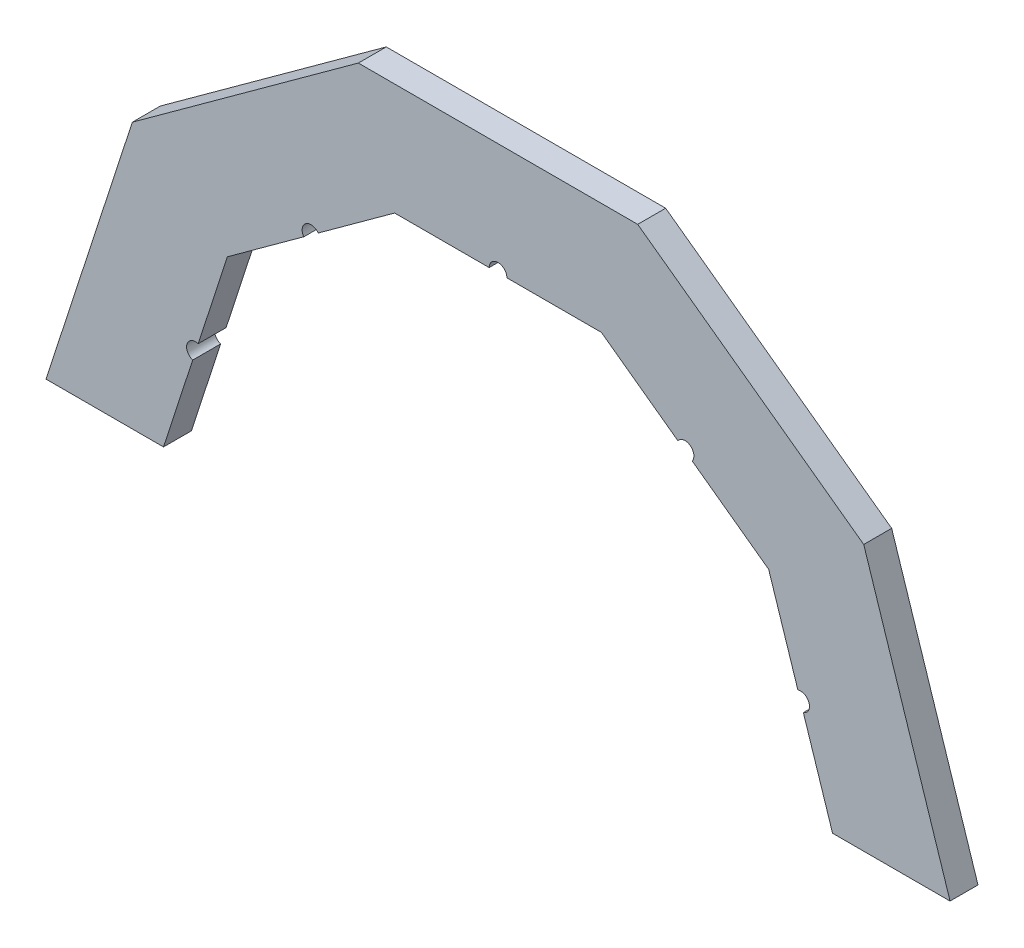
ISO-10303-21;
HEADER;
FILE_DESCRIPTION(('STEP AP214'),'2;1');
FILE_NAME('part.step','',(''),(''),'','','');
FILE_SCHEMA(('AUTOMOTIVE_DESIGN { 1 0 10303 214 1 1 1 1 }'));
ENDSEC;
DATA;
#1=APPLICATION_CONTEXT('core data for automotive mechanical design processes');
#2=APPLICATION_PROTOCOL_DEFINITION('international standard','automotive_design',2000,#1);
#3=PRODUCT_CONTEXT('',#1,'mechanical');
#4=PRODUCT('Part','Part','',(#3));
#5=PRODUCT_RELATED_PRODUCT_CATEGORY('part','',(#4));
#6=PRODUCT_DEFINITION_FORMATION('','',#4);
#7=PRODUCT_DEFINITION_CONTEXT('part definition',#1,'design');
#8=PRODUCT_DEFINITION('design','',#6,#7);
#9=PRODUCT_DEFINITION_SHAPE('','',#8);
#10=(LENGTH_UNIT() NAMED_UNIT(*) SI_UNIT(.MILLI.,.METRE.));
#11=(NAMED_UNIT(*) PLANE_ANGLE_UNIT() SI_UNIT($,.RADIAN.));
#12=(NAMED_UNIT(*) SI_UNIT($,.STERADIAN.) SOLID_ANGLE_UNIT());
#13=UNCERTAINTY_MEASURE_WITH_UNIT(LENGTH_MEASURE(1.E-05),#10,'distance_accuracy_value','');
#14=(GEOMETRIC_REPRESENTATION_CONTEXT(3) GLOBAL_UNCERTAINTY_ASSIGNED_CONTEXT((#13)) GLOBAL_UNIT_ASSIGNED_CONTEXT((#10,
#11,#12)) REPRESENTATION_CONTEXT('',''));
#15=CARTESIAN_POINT('',(0.,0.,0.));
#16=DIRECTION('',(0.,0.,1.));
#17=DIRECTION('',(1.,0.,0.));
#18=AXIS2_PLACEMENT_3D('',#15,#16,#17);
#19=CARTESIAN_POINT('',(119.744909905459,0.,10.));
#20=DIRECTION('',(0.,1.,0.));
#21=DIRECTION('',(-1.,0.,0.));
#22=AXIS2_PLACEMENT_3D('',#19,#20,#21);
#23=PLANE('',#22);
#24=DIRECTION('',(1.,0.,0.));
#25=VECTOR('',#24,1.);
#26=CARTESIAN_POINT('',(119.744909905459,0.,0.));
#27=LINE('',#26,#25);
#28=CARTESIAN_POINT('',(119.744909905459,0.,0.));
#29=VERTEX_POINT('',#28);
#30=CARTESIAN_POINT('',(161.803398874989,0.,0.));
#31=VERTEX_POINT('',#30);
#32=EDGE_CURVE('E233',#29,#31,#27,.T.);
#33=ORIENTED_EDGE('',*,*,#32,.T.);
#34=DIRECTION('',(0.,0.,-1.));
#35=VECTOR('',#34,1.);
#36=CARTESIAN_POINT('',(161.803398874989,0.,10.));
#37=LINE('',#36,#35);
#38=CARTESIAN_POINT('',(161.803398874989,0.,10.));
#39=VERTEX_POINT('',#38);
#40=EDGE_CURVE('E12',#39,#31,#37,.T.);
#41=ORIENTED_EDGE('',*,*,#40,.F.);
#42=DIRECTION('',(1.,0.,0.));
#43=VECTOR('',#42,1.);
#44=CARTESIAN_POINT('',(119.744909905459,0.,10.));
#45=LINE('',#44,#43);
#46=CARTESIAN_POINT('',(119.744909905459,0.,10.));
#47=VERTEX_POINT('',#46);
#48=EDGE_CURVE('E249',#47,#39,#45,.T.);
#49=ORIENTED_EDGE('',*,*,#48,.F.);
#50=DIRECTION('',(0.,0.,-1.));
#51=VECTOR('',#50,1.);
#52=CARTESIAN_POINT('',(119.744909905459,0.,10.));
#53=LINE('',#52,#51);
#54=EDGE_CURVE('E229',#47,#29,#53,.T.);
#55=ORIENTED_EDGE('',*,*,#54,.T.);
#56=EDGE_LOOP('',(#33,#41,#49,#55));
#57=FACE_BOUND('',#56,.T.);
#58=ADVANCED_FACE('F46',(#57),#23,.F.);
#59=CARTESIAN_POINT('',(161.803398874989,0.,10.));
#60=DIRECTION('',(-0.951056516295153,-0.309016994374948,0.));
#61=DIRECTION('',(0.309016994374948,-0.951056516295154,0.));
#62=AXIS2_PLACEMENT_3D('',#59,#60,#61);
#63=PLANE('',#62);
#64=DIRECTION('',(-0.309016994374948,0.951056516295153,0.));
#65=VECTOR('',#64,1.);
#66=CARTESIAN_POINT('',(161.803398874989,0.,0.));
#67=LINE('',#66,#65);
#68=CARTESIAN_POINT('',(130.901699437495,95.1056516295154,0.));
#69=VERTEX_POINT('',#68);
#70=EDGE_CURVE('E237',#31,#69,#67,.T.);
#71=ORIENTED_EDGE('',*,*,#70,.T.);
#72=DIRECTION('',(0.,0.,-1.));
#73=VECTOR('',#72,1.);
#74=CARTESIAN_POINT('',(130.901699437495,95.1056516295154,10.));
#75=LINE('',#74,#73);
#76=CARTESIAN_POINT('',(130.901699437495,95.1056516295154,10.));
#77=VERTEX_POINT('',#76);
#78=EDGE_CURVE('E55',#77,#69,#75,.T.);
#79=ORIENTED_EDGE('',*,*,#78,.F.);
#80=DIRECTION('',(-0.309016994374948,0.951056516295153,0.));
#81=VECTOR('',#80,1.);
#82=CARTESIAN_POINT('',(161.803398874989,0.,10.));
#83=LINE('',#82,#81);
#84=EDGE_CURVE('E148',#39,#77,#83,.T.);
#85=ORIENTED_EDGE('',*,*,#84,.F.);
#86=ORIENTED_EDGE('',*,*,#40,.T.);
#87=EDGE_LOOP('',(#71,#79,#85,#86));
#88=FACE_BOUND('',#87,.T.);
#89=ADVANCED_FACE('F580',(#88),#63,.F.);
#90=CARTESIAN_POINT('',(130.901699437495,95.1056516295154,10.));
#91=DIRECTION('',(-0.587785252292473,-0.809016994374948,0.));
#92=DIRECTION('',(0.809016994374948,-0.587785252292473,0.));
#93=AXIS2_PLACEMENT_3D('',#90,#91,#92);
#94=PLANE('',#93);
#95=DIRECTION('',(-0.809016994374948,0.587785252292473,0.));
#96=VECTOR('',#95,1.);
#97=CARTESIAN_POINT('',(130.901699437495,95.1056516295154,0.));
#98=LINE('',#97,#96);
#99=CARTESIAN_POINT('',(49.9999999999999,153.884176858763,0.));
#100=VERTEX_POINT('',#99);
#101=EDGE_CURVE('E327',#69,#100,#98,.T.);
#102=ORIENTED_EDGE('',*,*,#101,.T.);
#103=DIRECTION('',(0.,0.,-1.));
#104=VECTOR('',#103,1.);
#105=CARTESIAN_POINT('',(49.9999999999999,153.884176858763,10.));
#106=LINE('',#105,#104);
#107=CARTESIAN_POINT('',(49.9999999999999,153.884176858763,10.));
#108=VERTEX_POINT('',#107);
#109=EDGE_CURVE('E317',#108,#100,#106,.T.);
#110=ORIENTED_EDGE('',*,*,#109,.F.);
#111=DIRECTION('',(-0.809016994374948,0.587785252292473,0.));
#112=VECTOR('',#111,1.);
#113=CARTESIAN_POINT('',(130.901699437495,95.1056516295154,10.));
#114=LINE('',#113,#112);
#115=EDGE_CURVE('E328',#77,#108,#114,.T.);
#116=ORIENTED_EDGE('',*,*,#115,.F.);
#117=ORIENTED_EDGE('',*,*,#78,.T.);
#118=EDGE_LOOP('',(#102,#110,#116,#117));
#119=FACE_BOUND('',#118,.T.);
#120=ADVANCED_FACE('F325',(#119),#94,.F.);
#121=CARTESIAN_POINT('',(49.9999999999999,153.884176858763,10.));
#122=DIRECTION('',(0.,-1.,0.));
#123=DIRECTION('',(1.,0.,0.));
#124=AXIS2_PLACEMENT_3D('',#121,#122,#123);
#125=PLANE('',#124);
#126=DIRECTION('',(-1.,0.,0.));
#127=VECTOR('',#126,1.);
#128=CARTESIAN_POINT('',(49.9999999999999,153.884176858763,0.));
#129=LINE('',#128,#127);
#130=CARTESIAN_POINT('',(-50.,153.884176858763,0.));
#131=VERTEX_POINT('',#130);
#132=EDGE_CURVE('E334',#100,#131,#129,.T.);
#133=ORIENTED_EDGE('',*,*,#132,.T.);
#134=DIRECTION('',(0.,0.,-1.));
#135=VECTOR('',#134,1.);
#136=CARTESIAN_POINT('',(-50.,153.884176858763,10.));
#137=LINE('',#136,#135);
#138=CARTESIAN_POINT('',(-50.,153.884176858763,10.));
#139=VERTEX_POINT('',#138);
#140=EDGE_CURVE('E313',#139,#131,#137,.T.);
#141=ORIENTED_EDGE('',*,*,#140,.F.);
#142=DIRECTION('',(-1.,0.,0.));
#143=VECTOR('',#142,1.);
#144=CARTESIAN_POINT('',(49.9999999999999,153.884176858763,10.));
#145=LINE('',#144,#143);
#146=EDGE_CURVE('E448',#108,#139,#145,.T.);
#147=ORIENTED_EDGE('',*,*,#146,.F.);
#148=ORIENTED_EDGE('',*,*,#109,.T.);
#149=EDGE_LOOP('',(#133,#141,#147,#148));
#150=FACE_BOUND('',#149,.T.);
#151=ADVANCED_FACE('F585',(#150),#125,.F.);
#152=CARTESIAN_POINT('',(-50.,153.884176858763,10.));
#153=DIRECTION('',(0.587785252292473,-0.809016994374947,0.));
#154=DIRECTION('',(0.809016994374948,0.587785252292473,0.));
#155=AXIS2_PLACEMENT_3D('',#152,#153,#154);
#156=PLANE('',#155);
#157=DIRECTION('',(-0.809016994374947,-0.587785252292473,0.));
#158=VECTOR('',#157,1.);
#159=CARTESIAN_POINT('',(-50.,153.884176858763,0.));
#160=LINE('',#159,#158);
#161=CARTESIAN_POINT('',(-130.901699437495,95.1056516295153,0.));
#162=VERTEX_POINT('',#161);
#163=EDGE_CURVE('E339',#131,#162,#160,.T.);
#164=ORIENTED_EDGE('',*,*,#163,.T.);
#165=DIRECTION('',(0.,0.,-1.));
#166=VECTOR('',#165,1.);
#167=CARTESIAN_POINT('',(-130.901699437495,95.1056516295153,10.));
#168=LINE('',#167,#166);
#169=CARTESIAN_POINT('',(-130.901699437495,95.1056516295153,10.));
#170=VERTEX_POINT('',#169);
#171=EDGE_CURVE('E309',#170,#162,#168,.T.);
#172=ORIENTED_EDGE('',*,*,#171,.F.);
#173=DIRECTION('',(-0.809016994374947,-0.587785252292473,0.));
#174=VECTOR('',#173,1.);
#175=CARTESIAN_POINT('',(-50.,153.884176858763,10.));
#176=LINE('',#175,#174);
#177=EDGE_CURVE('E440',#139,#170,#176,.T.);
#178=ORIENTED_EDGE('',*,*,#177,.F.);
#179=ORIENTED_EDGE('',*,*,#140,.T.);
#180=EDGE_LOOP('',(#164,#172,#178,#179));
#181=FACE_BOUND('',#180,.T.);
#182=ADVANCED_FACE('F502',(#181),#156,.F.);
#183=CARTESIAN_POINT('',(-130.901699437495,95.1056516295153,10.));
#184=DIRECTION('',(0.951056516295154,-0.309016994374947,0.));
#185=DIRECTION('',(0.309016994374947,0.951056516295154,0.));
#186=AXIS2_PLACEMENT_3D('',#183,#184,#185);
#187=PLANE('',#186);
#188=DIRECTION('',(-0.309016994374947,-0.951056516295154,0.));
#189=VECTOR('',#188,1.);
#190=CARTESIAN_POINT('',(-130.901699437495,95.1056516295153,0.));
#191=LINE('',#190,#189);
#192=CARTESIAN_POINT('',(-161.803398874989,0.,0.));
#193=VERTEX_POINT('',#192);
#194=EDGE_CURVE('E351',#162,#193,#191,.T.);
#195=ORIENTED_EDGE('',*,*,#194,.T.);
#196=DIRECTION('',(0.,0.,-1.));
#197=VECTOR('',#196,1.);
#198=CARTESIAN_POINT('',(-161.803398874989,0.,10.));
#199=LINE('',#198,#197);
#200=CARTESIAN_POINT('',(-161.803398874989,0.,10.));
#201=VERTEX_POINT('',#200);
#202=EDGE_CURVE('E305',#201,#193,#199,.T.);
#203=ORIENTED_EDGE('',*,*,#202,.F.);
#204=DIRECTION('',(-0.309016994374947,-0.951056516295154,0.));
#205=VECTOR('',#204,1.);
#206=CARTESIAN_POINT('',(-130.901699437495,95.1056516295153,10.));
#207=LINE('',#206,#205);
#208=EDGE_CURVE('E437',#170,#201,#207,.T.);
#209=ORIENTED_EDGE('',*,*,#208,.F.);
#210=ORIENTED_EDGE('',*,*,#171,.T.);
#211=EDGE_LOOP('',(#195,#203,#209,#210));
#212=FACE_BOUND('',#211,.T.);
#213=ADVANCED_FACE('F505',(#212),#187,.F.);
#214=CARTESIAN_POINT('',(-161.803398874989,0.,10.));
#215=DIRECTION('',(0.,1.,0.));
#216=DIRECTION('',(-1.,0.,0.));
#217=AXIS2_PLACEMENT_3D('',#214,#215,#216);
#218=PLANE('',#217);
#219=DIRECTION('',(1.,0.,0.));
#220=VECTOR('',#219,1.);
#221=CARTESIAN_POINT('',(-161.803398874989,0.,0.));
#222=LINE('',#221,#220);
#223=CARTESIAN_POINT('',(-119.744909905459,0.,0.));
#224=VERTEX_POINT('',#223);
#225=EDGE_CURVE('E355',#193,#224,#222,.T.);
#226=ORIENTED_EDGE('',*,*,#225,.T.);
#227=DIRECTION('',(0.,0.,-1.));
#228=VECTOR('',#227,1.);
#229=CARTESIAN_POINT('',(-119.744909905459,0.,10.));
#230=LINE('',#229,#228);
#231=CARTESIAN_POINT('',(-119.744909905459,0.,10.));
#232=VERTEX_POINT('',#231);
#233=EDGE_CURVE('E301',#232,#224,#230,.T.);
#234=ORIENTED_EDGE('',*,*,#233,.F.);
#235=DIRECTION('',(1.,0.,0.));
#236=VECTOR('',#235,1.);
#237=CARTESIAN_POINT('',(-161.803398874989,0.,10.));
#238=LINE('',#237,#236);
#239=EDGE_CURVE('E439',#201,#232,#238,.T.);
#240=ORIENTED_EDGE('',*,*,#239,.F.);
#241=ORIENTED_EDGE('',*,*,#202,.T.);
#242=EDGE_LOOP('',(#226,#234,#240,#241));
#243=FACE_BOUND('',#242,.T.);
#244=ADVANCED_FACE('F508',(#243),#218,.F.);
#245=CARTESIAN_POINT('',(-109.291417461576,32.1725416005226,10.));
#246=DIRECTION('',(-0.951056516295154,0.309016994374946,0.));
#247=DIRECTION('',(-0.309016994374946,-0.951056516295154,0.));
#248=AXIS2_PLACEMENT_3D('',#245,#246,#247);
#249=PLANE('',#248);
#250=DIRECTION('',(0.309016994374946,0.951056516295154,0.));
#251=VECTOR('',#250,1.);
#252=CARTESIAN_POINT('',(-109.291417461576,32.1725416005226,0.));
#253=LINE('',#252,#251);
#254=CARTESIAN_POINT('',(-109.291417461576,32.1725416005226,0.));
#255=VERTEX_POINT('',#254);
#256=EDGE_CURVE('E359',#224,#255,#253,.T.);
#257=ORIENTED_EDGE('',*,*,#256,.T.);
#258=DIRECTION('',(0.,0.,-1.));
#259=VECTOR('',#258,1.);
#260=CARTESIAN_POINT('',(-109.291417461576,32.1725416005226,10.));
#261=LINE('',#260,#259);
#262=CARTESIAN_POINT('',(-109.291417461576,32.1725416005226,10.));
#263=VERTEX_POINT('',#262);
#264=EDGE_CURVE('E297',#263,#255,#261,.T.);
#265=ORIENTED_EDGE('',*,*,#264,.F.);
#266=DIRECTION('',(0.309016994374946,0.951056516295154,0.));
#267=VECTOR('',#266,1.);
#268=CARTESIAN_POINT('',(-109.291417461576,32.1725416005226,10.));
#269=LINE('',#268,#267);
#270=EDGE_CURVE('E460',#232,#263,#269,.T.);
#271=ORIENTED_EDGE('',*,*,#270,.F.);
#272=ORIENTED_EDGE('',*,*,#233,.T.);
#273=EDGE_LOOP('',(#257,#265,#271,#272));
#274=FACE_BOUND('',#273,.T.);
#275=ADVANCED_FACE('F513',(#274),#249,.F.);
#276=CARTESIAN_POINT('',(-108.310288504436,35.1921460397597,10.));
#277=DIRECTION('',(0.,0.,-1.));
#278=DIRECTION('',(-1.,0.,0.));
#279=AXIS2_PLACEMENT_3D('',#276,#277,#278);
#280=CYLINDRICAL_SURFACE('',#279,3.175);
#281=CARTESIAN_POINT('',(-108.310288504436,35.1921460397597,0.));
#282=DIRECTION('',(0.,0.,-1.));
#283=DIRECTION('',(-1.,0.,0.));
#284=AXIS2_PLACEMENT_3D('',#281,#282,#283);
#285=CIRCLE('',#284,3.175);
#286=CARTESIAN_POINT('',(-107.329159547295,38.2117504789969,0.));
#287=VERTEX_POINT('',#286);
#288=EDGE_CURVE('E367',#255,#287,#285,.T.);
#289=ORIENTED_EDGE('',*,*,#288,.T.);
#290=DIRECTION('',(0.,0.,-1.));
#291=VECTOR('',#290,1.);
#292=CARTESIAN_POINT('',(-107.329159547295,38.2117504789969,10.));
#293=LINE('',#292,#291);
#294=CARTESIAN_POINT('',(-107.329159547295,38.2117504789969,10.));
#295=VERTEX_POINT('',#294);
#296=EDGE_CURVE('E293',#295,#287,#293,.T.);
#297=ORIENTED_EDGE('',*,*,#296,.F.);
#298=CARTESIAN_POINT('',(-108.310288504436,35.1921460397597,10.));
#299=DIRECTION('',(0.,0.,-1.));
#300=DIRECTION('',(-1.,0.,0.));
#301=AXIS2_PLACEMENT_3D('',#298,#299,#300);
#302=CIRCLE('',#301,3.175);
#303=EDGE_CURVE('E465',#263,#295,#302,.T.);
#304=ORIENTED_EDGE('',*,*,#303,.F.);
#305=ORIENTED_EDGE('',*,*,#264,.T.);
#306=EDGE_LOOP('',(#289,#297,#304,#305));
#307=FACE_BOUND('',#306,.T.);
#308=ADVANCED_FACE('F519',(#307),#280,.F.);
#309=CARTESIAN_POINT('',(-96.8756671034131,70.3842920795195,10.));
#310=DIRECTION('',(-0.951056516295153,0.309016994374948,0.));
#311=DIRECTION('',(-0.309016994374948,-0.951056516295153,0.));
#312=AXIS2_PLACEMENT_3D('',#309,#310,#311);
#313=PLANE('',#312);
#314=DIRECTION('',(0.309016994374948,0.951056516295153,0.));
#315=VECTOR('',#314,1.);
#316=CARTESIAN_POINT('',(-96.8756671034131,70.3842920795195,0.));
#317=LINE('',#316,#315);
#318=CARTESIAN_POINT('',(-96.8756671034131,70.3842920795195,0.));
#319=VERTEX_POINT('',#318);
#320=EDGE_CURVE('E370',#287,#319,#317,.T.);
#321=ORIENTED_EDGE('',*,*,#320,.T.);
#322=DIRECTION('',(0.,0.,-1.));
#323=VECTOR('',#322,1.);
#324=CARTESIAN_POINT('',(-96.8756671034131,70.3842920795195,10.));
#325=LINE('',#324,#323);
#326=CARTESIAN_POINT('',(-96.8756671034131,70.3842920795195,10.));
#327=VERTEX_POINT('',#326);
#328=EDGE_CURVE('E290',#327,#319,#325,.T.);
#329=ORIENTED_EDGE('',*,*,#328,.F.);
#330=DIRECTION('',(0.309016994374948,0.951056516295153,0.));
#331=VECTOR('',#330,1.);
#332=CARTESIAN_POINT('',(-96.8756671034131,70.3842920795195,10.));
#333=LINE('',#332,#331);
#334=EDGE_CURVE('E458',#295,#327,#333,.T.);
#335=ORIENTED_EDGE('',*,*,#334,.F.);
#336=ORIENTED_EDGE('',*,*,#296,.T.);
#337=EDGE_LOOP('',(#321,#329,#335,#336));
#338=FACE_BOUND('',#337,.T.);
#339=ADVANCED_FACE('F523',(#338),#313,.F.);
#340=CARTESIAN_POINT('',(-69.5080685841889,90.2680162931124,10.));
#341=DIRECTION('',(-0.587785252292474,0.809016994374947,0.));
#342=DIRECTION('',(-0.809016994374947,-0.587785252292474,0.));
#343=AXIS2_PLACEMENT_3D('',#340,#341,#342);
#344=PLANE('',#343);
#345=DIRECTION('',(0.809016994374947,0.587785252292474,0.));
#346=VECTOR('',#345,1.);
#347=CARTESIAN_POINT('',(-69.5080685841889,90.2680162931124,0.));
#348=LINE('',#347,#346);
#349=CARTESIAN_POINT('',(-69.5080685841889,90.2680162931124,0.));
#350=VERTEX_POINT('',#349);
#351=EDGE_CURVE('E374',#319,#350,#348,.T.);
#352=ORIENTED_EDGE('',*,*,#351,.T.);
#353=DIRECTION('',(0.,0.,-1.));
#354=VECTOR('',#353,1.);
#355=CARTESIAN_POINT('',(-69.5080685841889,90.2680162931124,10.));
#356=LINE('',#355,#354);
#357=CARTESIAN_POINT('',(-69.5080685841889,90.2680162931124,10.));
#358=VERTEX_POINT('',#357);
#359=EDGE_CURVE('E286',#358,#350,#356,.T.);
#360=ORIENTED_EDGE('',*,*,#359,.F.);
#361=DIRECTION('',(0.809016994374947,0.587785252292474,0.));
#362=VECTOR('',#361,1.);
#363=CARTESIAN_POINT('',(-69.5080685841889,90.2680162931124,10.));
#364=LINE('',#363,#362);
#365=EDGE_CURVE('E455',#327,#358,#364,.T.);
#366=ORIENTED_EDGE('',*,*,#365,.F.);
#367=ORIENTED_EDGE('',*,*,#328,.T.);
#368=EDGE_LOOP('',(#352,#360,#366,#367));
#369=FACE_BOUND('',#368,.T.);
#370=ADVANCED_FACE('F528',(#369),#344,.F.);
#371=CARTESIAN_POINT('',(-66.9394396270484,92.134234469141,10.));
#372=DIRECTION('',(0.,0.,-1.));
#373=DIRECTION('',(-1.,0.,0.));
#374=AXIS2_PLACEMENT_3D('',#371,#372,#373);
#375=CYLINDRICAL_SURFACE('',#374,3.175);
#376=CARTESIAN_POINT('',(-66.9394396270484,92.134234469141,0.));
#377=DIRECTION('',(0.,0.,-1.));
#378=DIRECTION('',(-1.,0.,0.));
#379=AXIS2_PLACEMENT_3D('',#376,#377,#378);
#380=CIRCLE('',#379,3.175);
#381=CARTESIAN_POINT('',(-64.370810669908,94.0004526451697,0.));
#382=VERTEX_POINT('',#381);
#383=EDGE_CURVE('E378',#350,#382,#380,.T.);
#384=ORIENTED_EDGE('',*,*,#383,.T.);
#385=DIRECTION('',(0.,0.,-1.));
#386=VECTOR('',#385,1.);
#387=CARTESIAN_POINT('',(-64.370810669908,94.0004526451697,10.));
#388=LINE('',#387,#386);
#389=CARTESIAN_POINT('',(-64.370810669908,94.0004526451697,10.));
#390=VERTEX_POINT('',#389);
#391=EDGE_CURVE('E282',#390,#382,#388,.T.);
#392=ORIENTED_EDGE('',*,*,#391,.F.);
#393=CARTESIAN_POINT('',(-66.9394396270484,92.134234469141,10.));
#394=DIRECTION('',(0.,0.,-1.));
#395=DIRECTION('',(-1.,0.,0.));
#396=AXIS2_PLACEMENT_3D('',#393,#394,#395);
#397=CIRCLE('',#396,3.175);
#398=EDGE_CURVE('E457',#358,#390,#397,.T.);
#399=ORIENTED_EDGE('',*,*,#398,.F.);
#400=ORIENTED_EDGE('',*,*,#359,.T.);
#401=EDGE_LOOP('',(#384,#392,#399,#400));
#402=FACE_BOUND('',#401,.T.);
#403=ADVANCED_FACE('F534',(#402),#375,.F.);
#404=CARTESIAN_POINT('',(-37.0032121506837,113.884176858763,10.));
#405=DIRECTION('',(-0.587785252292473,0.809016994374948,0.));
#406=DIRECTION('',(-0.809016994374948,-0.587785252292473,0.));
#407=AXIS2_PLACEMENT_3D('',#404,#405,#406);
#408=PLANE('',#407);
#409=DIRECTION('',(0.809016994374948,0.587785252292473,0.));
#410=VECTOR('',#409,1.);
#411=CARTESIAN_POINT('',(-37.0032121506837,113.884176858763,0.));
#412=LINE('',#411,#410);
#413=CARTESIAN_POINT('',(-37.0032121506837,113.884176858763,0.));
#414=VERTEX_POINT('',#413);
#415=EDGE_CURVE('E386',#382,#414,#412,.T.);
#416=ORIENTED_EDGE('',*,*,#415,.T.);
#417=DIRECTION('',(0.,0.,-1.));
#418=VECTOR('',#417,1.);
#419=CARTESIAN_POINT('',(-37.0032121506837,113.884176858763,10.));
#420=LINE('',#419,#418);
#421=CARTESIAN_POINT('',(-37.0032121506837,113.884176858763,10.));
#422=VERTEX_POINT('',#421);
#423=EDGE_CURVE('E278',#422,#414,#420,.T.);
#424=ORIENTED_EDGE('',*,*,#423,.F.);
#425=DIRECTION('',(0.809016994374948,0.587785252292473,0.));
#426=VECTOR('',#425,1.);
#427=CARTESIAN_POINT('',(-37.0032121506837,113.884176858763,10.));
#428=LINE('',#427,#426);
#429=EDGE_CURVE('E452',#390,#422,#428,.T.);
#430=ORIENTED_EDGE('',*,*,#429,.F.);
#431=ORIENTED_EDGE('',*,*,#391,.T.);
#432=EDGE_LOOP('',(#416,#424,#430,#431));
#433=FACE_BOUND('',#432,.T.);
#434=ADVANCED_FACE('F538',(#433),#408,.F.);
#435=CARTESIAN_POINT('',(-3.17500000000008,113.884176858763,10.));
#436=DIRECTION('',(0.,1.,0.));
#437=DIRECTION('',(-1.,0.,0.));
#438=AXIS2_PLACEMENT_3D('',#435,#436,#437);
#439=PLANE('',#438);
#440=DIRECTION('',(1.,0.,0.));
#441=VECTOR('',#440,1.);
#442=CARTESIAN_POINT('',(-3.17500000000008,113.884176858763,0.));
#443=LINE('',#442,#441);
#444=CARTESIAN_POINT('',(-3.17500000000008,113.884176858763,0.));
#445=VERTEX_POINT('',#444);
#446=EDGE_CURVE('E389',#414,#445,#443,.T.);
#447=ORIENTED_EDGE('',*,*,#446,.T.);
#448=DIRECTION('',(0.,0.,-1.));
#449=VECTOR('',#448,1.);
#450=CARTESIAN_POINT('',(-3.17500000000008,113.884176858763,10.));
#451=LINE('',#450,#449);
#452=CARTESIAN_POINT('',(-3.17500000000008,113.884176858763,10.));
#453=VERTEX_POINT('',#452);
#454=EDGE_CURVE('E274',#453,#445,#451,.T.);
#455=ORIENTED_EDGE('',*,*,#454,.F.);
#456=DIRECTION('',(1.,0.,0.));
#457=VECTOR('',#456,1.);
#458=CARTESIAN_POINT('',(-3.17500000000008,113.884176858763,10.));
#459=LINE('',#458,#457);
#460=EDGE_CURVE('E451',#422,#453,#459,.T.);
#461=ORIENTED_EDGE('',*,*,#460,.F.);
#462=ORIENTED_EDGE('',*,*,#423,.T.);
#463=EDGE_LOOP('',(#447,#455,#461,#462));
#464=FACE_BOUND('',#463,.T.);
#465=ADVANCED_FACE('F543',(#464),#439,.F.);
#466=CARTESIAN_POINT('',(0.,113.884176858763,10.));
#467=DIRECTION('',(0.,0.,-1.));
#468=DIRECTION('',(-1.,0.,0.));
#469=AXIS2_PLACEMENT_3D('',#466,#467,#468);
#470=CYLINDRICAL_SURFACE('',#469,3.175);
#471=CARTESIAN_POINT('',(0.,113.884176858763,0.));
#472=DIRECTION('',(0.,0.,-1.));
#473=DIRECTION('',(-1.,0.,0.));
#474=AXIS2_PLACEMENT_3D('',#471,#472,#473);
#475=CIRCLE('',#474,3.175);
#476=CARTESIAN_POINT('',(3.175,113.884176858763,0.));
#477=VERTEX_POINT('',#476);
#478=EDGE_CURVE('E393',#445,#477,#475,.T.);
#479=ORIENTED_EDGE('',*,*,#478,.T.);
#480=DIRECTION('',(0.,0.,-1.));
#481=VECTOR('',#480,1.);
#482=CARTESIAN_POINT('',(3.175,113.884176858763,10.));
#483=LINE('',#482,#481);
#484=CARTESIAN_POINT('',(3.175,113.884176858763,10.));
#485=VERTEX_POINT('',#484);
#486=EDGE_CURVE('E270',#485,#477,#483,.T.);
#487=ORIENTED_EDGE('',*,*,#486,.F.);
#488=CARTESIAN_POINT('',(0.,113.884176858763,10.));
#489=DIRECTION('',(0.,0.,-1.));
#490=DIRECTION('',(-1.,0.,0.));
#491=AXIS2_PLACEMENT_3D('',#488,#489,#490);
#492=CIRCLE('',#491,3.175);
#493=EDGE_CURVE('E430',#453,#485,#492,.T.);
#494=ORIENTED_EDGE('',*,*,#493,.F.);
#495=ORIENTED_EDGE('',*,*,#454,.T.);
#496=EDGE_LOOP('',(#479,#487,#494,#495));
#497=FACE_BOUND('',#496,.T.);
#498=ADVANCED_FACE('F549',(#497),#470,.F.);
#499=CARTESIAN_POINT('',(37.0032121506837,113.884176858763,10.));
#500=DIRECTION('',(0.,1.,0.));
#501=DIRECTION('',(-1.,0.,0.));
#502=AXIS2_PLACEMENT_3D('',#499,#500,#501);
#503=PLANE('',#502);
#504=DIRECTION('',(1.,0.,0.));
#505=VECTOR('',#504,1.);
#506=CARTESIAN_POINT('',(37.0032121506837,113.884176858763,0.));
#507=LINE('',#506,#505);
#508=CARTESIAN_POINT('',(37.0032121506837,113.884176858763,0.));
#509=VERTEX_POINT('',#508);
#510=EDGE_CURVE('E397',#477,#509,#507,.T.);
#511=ORIENTED_EDGE('',*,*,#510,.T.);
#512=DIRECTION('',(0.,0.,-1.));
#513=VECTOR('',#512,1.);
#514=CARTESIAN_POINT('',(37.0032121506837,113.884176858763,10.));
#515=LINE('',#514,#513);
#516=CARTESIAN_POINT('',(37.0032121506837,113.884176858763,10.));
#517=VERTEX_POINT('',#516);
#518=EDGE_CURVE('E266',#517,#509,#515,.T.);
#519=ORIENTED_EDGE('',*,*,#518,.F.);
#520=DIRECTION('',(1.,0.,0.));
#521=VECTOR('',#520,1.);
#522=CARTESIAN_POINT('',(37.0032121506837,113.884176858763,10.));
#523=LINE('',#522,#521);
#524=EDGE_CURVE('E428',#485,#517,#523,.T.);
#525=ORIENTED_EDGE('',*,*,#524,.F.);
#526=ORIENTED_EDGE('',*,*,#486,.T.);
#527=EDGE_LOOP('',(#511,#519,#525,#526));
#528=FACE_BOUND('',#527,.T.);
#529=ADVANCED_FACE('F553',(#528),#503,.F.);
#530=CARTESIAN_POINT('',(64.3708106699079,94.0004526451697,10.));
#531=DIRECTION('',(0.587785252292473,0.809016994374947,0.));
#532=DIRECTION('',(-0.809016994374948,0.587785252292473,0.));
#533=AXIS2_PLACEMENT_3D('',#530,#531,#532);
#534=PLANE('',#533);
#535=DIRECTION('',(0.809016994374947,-0.587785252292473,0.));
#536=VECTOR('',#535,1.);
#537=CARTESIAN_POINT('',(64.3708106699079,94.0004526451697,0.));
#538=LINE('',#537,#536);
#539=CARTESIAN_POINT('',(64.3708106699079,94.0004526451697,0.));
#540=VERTEX_POINT('',#539);
#541=EDGE_CURVE('E405',#509,#540,#538,.T.);
#542=ORIENTED_EDGE('',*,*,#541,.T.);
#543=DIRECTION('',(0.,0.,-1.));
#544=VECTOR('',#543,1.);
#545=CARTESIAN_POINT('',(64.3708106699079,94.0004526451697,10.));
#546=LINE('',#545,#544);
#547=CARTESIAN_POINT('',(64.3708106699079,94.0004526451697,10.));
#548=VERTEX_POINT('',#547);
#549=EDGE_CURVE('E262',#548,#540,#546,.T.);
#550=ORIENTED_EDGE('',*,*,#549,.F.);
#551=DIRECTION('',(0.809016994374947,-0.587785252292473,0.));
#552=VECTOR('',#551,1.);
#553=CARTESIAN_POINT('',(64.3708106699079,94.0004526451697,10.));
#554=LINE('',#553,#552);
#555=EDGE_CURVE('E429',#517,#548,#554,.T.);
#556=ORIENTED_EDGE('',*,*,#555,.F.);
#557=ORIENTED_EDGE('',*,*,#518,.T.);
#558=EDGE_LOOP('',(#542,#550,#556,#557));
#559=FACE_BOUND('',#558,.T.);
#560=ADVANCED_FACE('F558',(#559),#534,.F.);
#561=CARTESIAN_POINT('',(66.9394396270484,92.1342344691411,10.));
#562=DIRECTION('',(0.,0.,-1.));
#563=DIRECTION('',(-1.,0.,0.));
#564=AXIS2_PLACEMENT_3D('',#561,#562,#563);
#565=CYLINDRICAL_SURFACE('',#564,3.17499999999999);
#566=CARTESIAN_POINT('',(66.9394396270484,92.1342344691411,0.));
#567=DIRECTION('',(0.,0.,-1.));
#568=DIRECTION('',(-1.,0.,0.));
#569=AXIS2_PLACEMENT_3D('',#566,#567,#568);
#570=CIRCLE('',#569,3.17499999999999);
#571=CARTESIAN_POINT('',(69.5080685841888,90.2680162931125,0.));
#572=VERTEX_POINT('',#571);
#573=EDGE_CURVE('E408',#540,#572,#570,.T.);
#574=ORIENTED_EDGE('',*,*,#573,.T.);
#575=DIRECTION('',(0.,0.,-1.));
#576=VECTOR('',#575,1.);
#577=CARTESIAN_POINT('',(69.5080685841888,90.2680162931125,10.));
#578=LINE('',#577,#576);
#579=CARTESIAN_POINT('',(69.5080685841888,90.2680162931125,10.));
#580=VERTEX_POINT('',#579);
#581=EDGE_CURVE('E258',#580,#572,#578,.T.);
#582=ORIENTED_EDGE('',*,*,#581,.F.);
#583=CARTESIAN_POINT('',(66.9394396270484,92.1342344691411,10.));
#584=DIRECTION('',(0.,0.,-1.));
#585=DIRECTION('',(-1.,0.,0.));
#586=AXIS2_PLACEMENT_3D('',#583,#584,#585);
#587=CIRCLE('',#586,3.17499999999999);
#588=EDGE_CURVE('E481',#548,#580,#587,.T.);
#589=ORIENTED_EDGE('',*,*,#588,.F.);
#590=ORIENTED_EDGE('',*,*,#549,.T.);
#591=EDGE_LOOP('',(#574,#582,#589,#590));
#592=FACE_BOUND('',#591,.T.);
#593=ADVANCED_FACE('F562',(#592),#565,.F.);
#594=CARTESIAN_POINT('',(96.875667103413,70.3842920795196,10.));
#595=DIRECTION('',(0.587785252292473,0.809016994374947,0.));
#596=DIRECTION('',(-0.809016994374948,0.587785252292473,0.));
#597=AXIS2_PLACEMENT_3D('',#594,#595,#596);
#598=PLANE('',#597);
#599=DIRECTION('',(0.809016994374947,-0.587785252292473,0.));
#600=VECTOR('',#599,1.);
#601=CARTESIAN_POINT('',(96.875667103413,70.3842920795196,0.));
#602=LINE('',#601,#600);
#603=CARTESIAN_POINT('',(96.875667103413,70.3842920795196,0.));
#604=VERTEX_POINT('',#603);
#605=EDGE_CURVE('E412',#572,#604,#602,.T.);
#606=ORIENTED_EDGE('',*,*,#605,.T.);
#607=DIRECTION('',(0.,0.,-1.));
#608=VECTOR('',#607,1.);
#609=CARTESIAN_POINT('',(96.875667103413,70.3842920795196,10.));
#610=LINE('',#609,#608);
#611=CARTESIAN_POINT('',(96.875667103413,70.3842920795196,10.));
#612=VERTEX_POINT('',#611);
#613=EDGE_CURVE('E220',#612,#604,#610,.T.);
#614=ORIENTED_EDGE('',*,*,#613,.F.);
#615=DIRECTION('',(0.809016994374947,-0.587785252292473,0.));
#616=VECTOR('',#615,1.);
#617=CARTESIAN_POINT('',(96.875667103413,70.3842920795196,10.));
#618=LINE('',#617,#616);
#619=EDGE_CURVE('E209',#580,#612,#618,.T.);
#620=ORIENTED_EDGE('',*,*,#619,.F.);
#621=ORIENTED_EDGE('',*,*,#581,.T.);
#622=EDGE_LOOP('',(#606,#614,#620,#621));
#623=FACE_BOUND('',#622,.T.);
#624=ADVANCED_FACE('F566',(#623),#598,.F.);
#625=CARTESIAN_POINT('',(107.329159547295,38.2117504789969,10.));
#626=DIRECTION('',(0.951056516295153,0.309016994374949,0.));
#627=DIRECTION('',(-0.309016994374949,0.951056516295153,0.));
#628=AXIS2_PLACEMENT_3D('',#625,#626,#627);
#629=PLANE('',#628);
#630=DIRECTION('',(0.309016994374949,-0.951056516295153,0.));
#631=VECTOR('',#630,1.);
#632=CARTESIAN_POINT('',(107.329159547295,38.2117504789969,0.));
#633=LINE('',#632,#631);
#634=CARTESIAN_POINT('',(107.329159547295,38.2117504789969,0.));
#635=VERTEX_POINT('',#634);
#636=EDGE_CURVE('E218',#604,#635,#633,.T.);
#637=ORIENTED_EDGE('',*,*,#636,.T.);
#638=DIRECTION('',(0.,0.,-1.));
#639=VECTOR('',#638,1.);
#640=CARTESIAN_POINT('',(107.329159547295,38.2117504789969,10.));
#641=LINE('',#640,#639);
#642=CARTESIAN_POINT('',(107.329159547295,38.2117504789969,10.));
#643=VERTEX_POINT('',#642);
#644=EDGE_CURVE('E215',#643,#635,#641,.T.);
#645=ORIENTED_EDGE('',*,*,#644,.F.);
#646=DIRECTION('',(0.309016994374949,-0.951056516295153,0.));
#647=VECTOR('',#646,1.);
#648=CARTESIAN_POINT('',(107.329159547295,38.2117504789969,10.));
#649=LINE('',#648,#647);
#650=EDGE_CURVE('E203',#612,#643,#649,.T.);
#651=ORIENTED_EDGE('',*,*,#650,.F.);
#652=ORIENTED_EDGE('',*,*,#613,.T.);
#653=EDGE_LOOP('',(#637,#645,#651,#652));
#654=FACE_BOUND('',#653,.T.);
#655=ADVANCED_FACE('F216',(#654),#629,.F.);
#656=CARTESIAN_POINT('',(108.310288504436,35.1921460397598,10.));
#657=DIRECTION('',(0.,0.,-1.));
#658=DIRECTION('',(-1.,0.,0.));
#659=AXIS2_PLACEMENT_3D('',#656,#657,#658);
#660=CYLINDRICAL_SURFACE('',#659,3.175);
#661=CARTESIAN_POINT('',(108.310288504436,35.1921460397598,0.));
#662=DIRECTION('',(0.,0.,-1.));
#663=DIRECTION('',(-1.,0.,0.));
#664=AXIS2_PLACEMENT_3D('',#661,#662,#663);
#665=CIRCLE('',#664,3.175);
#666=CARTESIAN_POINT('',(109.291417461576,32.1725416005227,0.));
#667=VERTEX_POINT('',#666);
#668=EDGE_CURVE('E134',#635,#667,#665,.T.);
#669=ORIENTED_EDGE('',*,*,#668,.T.);
#670=DIRECTION('',(0.,0.,-1.));
#671=VECTOR('',#670,1.);
#672=CARTESIAN_POINT('',(109.291417461576,32.1725416005227,10.));
#673=LINE('',#672,#671);
#674=CARTESIAN_POINT('',(109.291417461576,32.1725416005227,10.));
#675=VERTEX_POINT('',#674);
#676=EDGE_CURVE('E221',#675,#667,#673,.T.);
#677=ORIENTED_EDGE('',*,*,#676,.F.);
#678=CARTESIAN_POINT('',(108.310288504436,35.1921460397598,10.));
#679=DIRECTION('',(0.,0.,-1.));
#680=DIRECTION('',(-1.,0.,0.));
#681=AXIS2_PLACEMENT_3D('',#678,#679,#680);
#682=CIRCLE('',#681,3.175);
#683=EDGE_CURVE('E207',#643,#675,#682,.T.);
#684=ORIENTED_EDGE('',*,*,#683,.F.);
#685=ORIENTED_EDGE('',*,*,#644,.T.);
#686=EDGE_LOOP('',(#669,#677,#684,#685));
#687=FACE_BOUND('',#686,.T.);
#688=ADVANCED_FACE('F223',(#687),#660,.F.);
#689=CARTESIAN_POINT('',(119.744909905459,0.,10.));
#690=DIRECTION('',(0.951056516295154,0.309016994374946,0.));
#691=DIRECTION('',(-0.309016994374946,0.951056516295154,0.));
#692=AXIS2_PLACEMENT_3D('',#689,#690,#691);
#693=PLANE('',#692);
#694=DIRECTION('',(0.309016994374946,-0.951056516295154,0.));
#695=VECTOR('',#694,1.);
#696=CARTESIAN_POINT('',(119.744909905459,0.,0.));
#697=LINE('',#696,#695);
#698=EDGE_CURVE('E140',#667,#29,#697,.T.);
#699=ORIENTED_EDGE('',*,*,#698,.T.);
#700=ORIENTED_EDGE('',*,*,#54,.F.);
#701=DIRECTION('',(0.309016994374946,-0.951056516295154,0.));
#702=VECTOR('',#701,1.);
#703=CARTESIAN_POINT('',(119.744909905459,0.,10.));
#704=LINE('',#703,#702);
#705=EDGE_CURVE('E63',#675,#47,#704,.T.);
#706=ORIENTED_EDGE('',*,*,#705,.F.);
#707=ORIENTED_EDGE('',*,*,#676,.T.);
#708=EDGE_LOOP('',(#699,#700,#706,#707));
#709=FACE_BOUND('',#708,.T.);
#710=ADVANCED_FACE('F570',(#709),#693,.F.);
#711=CARTESIAN_POINT('',(-108.310288504436,35.1921460397597,10.));
#712=DIRECTION('',(0.,0.,-1.));
#713=DIRECTION('',(-1.,0.,0.));
#714=AXIS2_PLACEMENT_3D('',#711,#712,#713);
#715=PLANE('',#714);
#716=ORIENTED_EDGE('',*,*,#48,.T.);
#717=ORIENTED_EDGE('',*,*,#84,.T.);
#718=ORIENTED_EDGE('',*,*,#115,.T.);
#719=ORIENTED_EDGE('',*,*,#146,.T.);
#720=ORIENTED_EDGE('',*,*,#177,.T.);
#721=ORIENTED_EDGE('',*,*,#208,.T.);
#722=ORIENTED_EDGE('',*,*,#239,.T.);
#723=ORIENTED_EDGE('',*,*,#270,.T.);
#724=ORIENTED_EDGE('',*,*,#303,.T.);
#725=ORIENTED_EDGE('',*,*,#334,.T.);
#726=ORIENTED_EDGE('',*,*,#365,.T.);
#727=ORIENTED_EDGE('',*,*,#398,.T.);
#728=ORIENTED_EDGE('',*,*,#429,.T.);
#729=ORIENTED_EDGE('',*,*,#460,.T.);
#730=ORIENTED_EDGE('',*,*,#493,.T.);
#731=ORIENTED_EDGE('',*,*,#524,.T.);
#732=ORIENTED_EDGE('',*,*,#555,.T.);
#733=ORIENTED_EDGE('',*,*,#588,.T.);
#734=ORIENTED_EDGE('',*,*,#619,.T.);
#735=ORIENTED_EDGE('',*,*,#650,.T.);
#736=ORIENTED_EDGE('',*,*,#683,.T.);
#737=ORIENTED_EDGE('',*,*,#705,.T.);
#738=EDGE_LOOP('',(#716,#717,#718,#719,#720,#721,#722,#723,#724,#725,#726,#727,#728,#729,#730,
#731,#732,#733,#734,#735,#736,#737));
#739=FACE_BOUND('',#738,.T.);
#740=ADVANCED_FACE('F205',(#739),#715,.F.);
#741=CARTESIAN_POINT('',(-108.310288504436,35.1921460397597,0.));
#742=DIRECTION('',(0.,0.,-1.));
#743=DIRECTION('',(-1.,0.,0.));
#744=AXIS2_PLACEMENT_3D('',#741,#742,#743);
#745=PLANE('',#744);
#746=ORIENTED_EDGE('',*,*,#32,.F.);
#747=ORIENTED_EDGE('',*,*,#698,.F.);
#748=ORIENTED_EDGE('',*,*,#668,.F.);
#749=ORIENTED_EDGE('',*,*,#636,.F.);
#750=ORIENTED_EDGE('',*,*,#605,.F.);
#751=ORIENTED_EDGE('',*,*,#573,.F.);
#752=ORIENTED_EDGE('',*,*,#541,.F.);
#753=ORIENTED_EDGE('',*,*,#510,.F.);
#754=ORIENTED_EDGE('',*,*,#478,.F.);
#755=ORIENTED_EDGE('',*,*,#446,.F.);
#756=ORIENTED_EDGE('',*,*,#415,.F.);
#757=ORIENTED_EDGE('',*,*,#383,.F.);
#758=ORIENTED_EDGE('',*,*,#351,.F.);
#759=ORIENTED_EDGE('',*,*,#320,.F.);
#760=ORIENTED_EDGE('',*,*,#288,.F.);
#761=ORIENTED_EDGE('',*,*,#256,.F.);
#762=ORIENTED_EDGE('',*,*,#225,.F.);
#763=ORIENTED_EDGE('',*,*,#194,.F.);
#764=ORIENTED_EDGE('',*,*,#163,.F.);
#765=ORIENTED_EDGE('',*,*,#132,.F.);
#766=ORIENTED_EDGE('',*,*,#101,.F.);
#767=ORIENTED_EDGE('',*,*,#70,.F.);
#768=EDGE_LOOP('',(#746,#747,#748,#749,#750,#751,#752,#753,#754,#755,#756,#757,#758,#759,#760,
#761,#762,#763,#764,#765,#766,#767));
#769=FACE_BOUND('',#768,.T.);
#770=ADVANCED_FACE('F332',(#769),#745,.T.);
#771=CLOSED_SHELL('',(#58,#89,#120,#151,#182,#213,#244,#275,#308,#339,#370,#403,#434,#465,#498,
#529,#560,#593,#624,#655,#688,#710,#740,#770));
#772=MANIFOLD_SOLID_BREP('B2',#771);
#773=ADVANCED_BREP_SHAPE_REPRESENTATION('',(#18,#772),#14);
#774=SHAPE_DEFINITION_REPRESENTATION(#9,#773);
ENDSEC;
END-ISO-10303-21;
